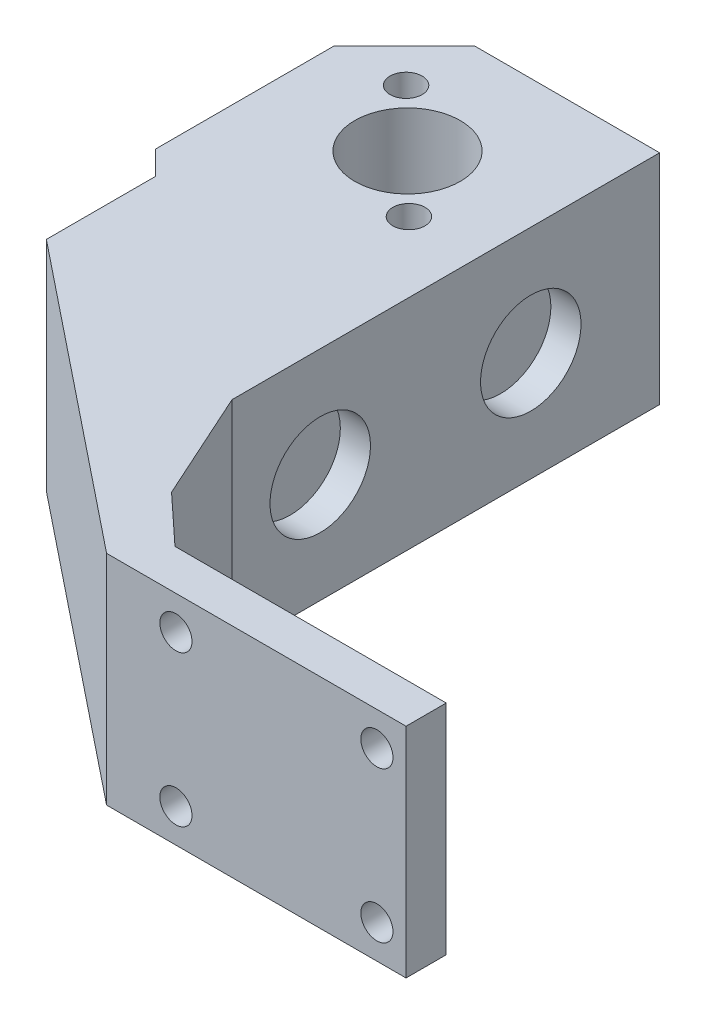
ISO-10303-21;
HEADER;
FILE_DESCRIPTION(('STEP AP214'),'2;1');
FILE_NAME('part.step','',(''),(''),'','','');
FILE_SCHEMA(('AUTOMOTIVE_DESIGN { 1 0 10303 214 1 1 1 1 }'));
ENDSEC;
DATA;
#1=APPLICATION_CONTEXT('core data for automotive mechanical design processes');
#2=APPLICATION_PROTOCOL_DEFINITION('international standard','automotive_design',2000,#1);
#3=PRODUCT_CONTEXT('',#1,'mechanical');
#4=PRODUCT('Part','Part','',(#3));
#5=PRODUCT_RELATED_PRODUCT_CATEGORY('part','',(#4));
#6=PRODUCT_DEFINITION_FORMATION('','',#4);
#7=PRODUCT_DEFINITION_CONTEXT('part definition',#1,'design');
#8=PRODUCT_DEFINITION('design','',#6,#7);
#9=PRODUCT_DEFINITION_SHAPE('','',#8);
#10=(LENGTH_UNIT() NAMED_UNIT(*) SI_UNIT(.MILLI.,.METRE.));
#11=(NAMED_UNIT(*) PLANE_ANGLE_UNIT() SI_UNIT($,.RADIAN.));
#12=(NAMED_UNIT(*) SI_UNIT($,.STERADIAN.) SOLID_ANGLE_UNIT());
#13=UNCERTAINTY_MEASURE_WITH_UNIT(LENGTH_MEASURE(1.E-05),#10,'distance_accuracy_value','');
#14=(GEOMETRIC_REPRESENTATION_CONTEXT(3) GLOBAL_UNCERTAINTY_ASSIGNED_CONTEXT((#13)) GLOBAL_UNIT_ASSIGNED_CONTEXT((#10,
#11,#12)) REPRESENTATION_CONTEXT('',''));
#15=CARTESIAN_POINT('',(0.,0.,0.));
#16=DIRECTION('',(0.,0.,1.));
#17=DIRECTION('',(1.,0.,0.));
#18=AXIS2_PLACEMENT_3D('',#15,#16,#17);
#19=CARTESIAN_POINT('',(0.,0.,4.));
#20=DIRECTION('',(0.,0.,1.));
#21=DIRECTION('',(1.,0.,0.));
#22=AXIS2_PLACEMENT_3D('',#19,#20,#21);
#23=PLANE('',#22);
#24=CARTESIAN_POINT('',(13.3119814523276,-16.5914088903663,4.));
#25=DIRECTION('',(0.,0.,1.));
#26=DIRECTION('',(1.,0.,0.));
#27=AXIS2_PLACEMENT_3D('',#24,#25,#26);
#28=CIRCLE('',#27,1.6);
#29=CARTESIAN_POINT('',(14.9119814523276,-16.5914088903663,4.));
#30=VERTEX_POINT('',#29);
#31=EDGE_CURVE('E183',#30,#30,#28,.T.);
#32=ORIENTED_EDGE('',*,*,#31,.F.);
#33=EDGE_LOOP('',(#32));
#34=FACE_BOUND('',#33,.T.);
#35=CARTESIAN_POINT('',(-6.68801854767252,-1.59140889036635,4.));
#36=DIRECTION('',(0.,0.,1.));
#37=DIRECTION('',(1.,0.,0.));
#38=AXIS2_PLACEMENT_3D('',#35,#36,#37);
#39=CIRCLE('',#38,1.6);
#40=CARTESIAN_POINT('',(-5.08801854767253,-1.59140889036635,4.));
#41=VERTEX_POINT('',#40);
#42=EDGE_CURVE('E195',#41,#41,#39,.T.);
#43=ORIENTED_EDGE('',*,*,#42,.F.);
#44=EDGE_LOOP('',(#43));
#45=FACE_BOUND('',#44,.T.);
#46=DIRECTION('',(0.,1.,0.));
#47=VECTOR('',#46,1.);
#48=CARTESIAN_POINT('',(16.2119814523275,-19.9414088903663,4.));
#49=LINE('',#48,#47);
#50=CARTESIAN_POINT('',(16.2119814523275,-19.9414088903663,4.));
#51=VERTEX_POINT('',#50);
#52=CARTESIAN_POINT('',(16.2119814523275,1.75859110963365,4.));
#53=VERTEX_POINT('',#52);
#54=EDGE_CURVE('E201',#51,#53,#49,.T.);
#55=ORIENTED_EDGE('',*,*,#54,.T.);
#56=DIRECTION('',(-1.,0.,0.));
#57=VECTOR('',#56,1.);
#58=CARTESIAN_POINT('',(16.2119814523275,1.75859110963365,4.));
#59=LINE('',#58,#57);
#60=CARTESIAN_POINT('',(-13.5880185476725,1.75859110963365,4.));
#61=VERTEX_POINT('',#60);
#62=EDGE_CURVE('E128',#53,#61,#59,.T.);
#63=ORIENTED_EDGE('',*,*,#62,.T.);
#64=DIRECTION('',(0.,1.,0.));
#65=VECTOR('',#64,1.);
#66=CARTESIAN_POINT('',(-13.5880185476725,-19.9414088903663,4.));
#67=LINE('',#66,#65);
#68=CARTESIAN_POINT('',(-13.5880185476725,-19.9414088903663,4.));
#69=VERTEX_POINT('',#68);
#70=EDGE_CURVE('E122',#69,#61,#67,.T.);
#71=ORIENTED_EDGE('',*,*,#70,.F.);
#72=DIRECTION('',(1.,0.,0.));
#73=VECTOR('',#72,1.);
#74=CARTESIAN_POINT('',(16.2119814523275,-19.9414088903663,4.));
#75=LINE('',#74,#73);
#76=EDGE_CURVE('E126',#69,#51,#75,.T.);
#77=ORIENTED_EDGE('',*,*,#76,.T.);
#78=EDGE_LOOP('',(#55,#63,#71,#77));
#79=FACE_BOUND('',#78,.T.);
#80=CARTESIAN_POINT('',(13.3119814523275,-1.59140889036635,4.));
#81=DIRECTION('',(0.,0.,1.));
#82=DIRECTION('',(1.,0.,0.));
#83=AXIS2_PLACEMENT_3D('',#80,#81,#82);
#84=CIRCLE('',#83,1.6);
#85=CARTESIAN_POINT('',(14.9119814523275,-1.59140889036635,4.));
#86=VERTEX_POINT('',#85);
#87=EDGE_CURVE('E189',#86,#86,#84,.T.);
#88=ORIENTED_EDGE('',*,*,#87,.F.);
#89=EDGE_LOOP('',(#88));
#90=FACE_BOUND('',#89,.T.);
#91=CARTESIAN_POINT('',(-6.68801854767237,-16.5914088903663,4.));
#92=DIRECTION('',(0.,0.,1.));
#93=DIRECTION('',(1.,0.,0.));
#94=AXIS2_PLACEMENT_3D('',#91,#92,#93);
#95=CIRCLE('',#94,1.6);
#96=CARTESIAN_POINT('',(-5.08801854767237,-16.5914088903663,4.));
#97=VERTEX_POINT('',#96);
#98=EDGE_CURVE('E177',#97,#97,#95,.T.);
#99=ORIENTED_EDGE('',*,*,#98,.F.);
#100=EDGE_LOOP('',(#99));
#101=FACE_BOUND('',#100,.T.);
#102=ADVANCED_FACE('F35',(#34,#45,#79,#90,#101),#23,.T.);
#103=CARTESIAN_POINT('',(0.,0.,0.));
#104=DIRECTION('',(0.,0.,1.));
#105=DIRECTION('',(1.,0.,0.));
#106=AXIS2_PLACEMENT_3D('',#103,#104,#105);
#107=PLANE('',#106);
#108=DIRECTION('',(1.,0.,0.));
#109=VECTOR('',#108,1.);
#110=CARTESIAN_POINT('',(16.2119814523275,-19.9414088903663,0.));
#111=LINE('',#110,#109);
#112=CARTESIAN_POINT('',(-10.783404097235,-19.9414088903663,0.));
#113=VERTEX_POINT('',#112);
#114=CARTESIAN_POINT('',(16.2119814523275,-19.9414088903663,0.));
#115=VERTEX_POINT('',#114);
#116=EDGE_CURVE('E203',#113,#115,#111,.T.);
#117=ORIENTED_EDGE('',*,*,#116,.F.);
#118=DIRECTION('',(0.,1.,0.));
#119=VECTOR('',#118,1.);
#120=CARTESIAN_POINT('',(-10.783404097235,-91.2750298070564,0.));
#121=LINE('',#120,#119);
#122=CARTESIAN_POINT('',(-10.783404097235,1.75859110963365,0.));
#123=VERTEX_POINT('',#122);
#124=EDGE_CURVE('E149',#113,#123,#121,.T.);
#125=ORIENTED_EDGE('',*,*,#124,.T.);
#126=DIRECTION('',(-1.,0.,0.));
#127=VECTOR('',#126,1.);
#128=CARTESIAN_POINT('',(16.2119814523275,1.75859110963365,0.));
#129=LINE('',#128,#127);
#130=CARTESIAN_POINT('',(16.2119814523275,1.75859110963365,0.));
#131=VERTEX_POINT('',#130);
#132=EDGE_CURVE('E207',#131,#123,#129,.T.);
#133=ORIENTED_EDGE('',*,*,#132,.F.);
#134=DIRECTION('',(0.,1.,0.));
#135=VECTOR('',#134,1.);
#136=CARTESIAN_POINT('',(16.2119814523275,-19.9414088903663,0.));
#137=LINE('',#136,#135);
#138=EDGE_CURVE('E198',#115,#131,#137,.T.);
#139=ORIENTED_EDGE('',*,*,#138,.F.);
#140=EDGE_LOOP('',(#117,#125,#133,#139));
#141=FACE_BOUND('',#140,.T.);
#142=CARTESIAN_POINT('',(-6.68801854767252,-1.59140889036635,0.));
#143=DIRECTION('',(0.,0.,1.));
#144=DIRECTION('',(1.,0.,0.));
#145=AXIS2_PLACEMENT_3D('',#142,#143,#144);
#146=CIRCLE('',#145,1.6);
#147=CARTESIAN_POINT('',(-5.08801854767253,-1.59140889036635,0.));
#148=VERTEX_POINT('',#147);
#149=EDGE_CURVE('E192',#148,#148,#146,.T.);
#150=ORIENTED_EDGE('',*,*,#149,.T.);
#151=EDGE_LOOP('',(#150));
#152=FACE_BOUND('',#151,.T.);
#153=CARTESIAN_POINT('',(13.3119814523275,-1.59140889036635,0.));
#154=DIRECTION('',(0.,0.,1.));
#155=DIRECTION('',(1.,0.,0.));
#156=AXIS2_PLACEMENT_3D('',#153,#154,#155);
#157=CIRCLE('',#156,1.6);
#158=CARTESIAN_POINT('',(14.9119814523275,-1.59140889036635,0.));
#159=VERTEX_POINT('',#158);
#160=EDGE_CURVE('E186',#159,#159,#157,.T.);
#161=ORIENTED_EDGE('',*,*,#160,.T.);
#162=EDGE_LOOP('',(#161));
#163=FACE_BOUND('',#162,.T.);
#164=CARTESIAN_POINT('',(13.3119814523276,-16.5914088903663,0.));
#165=DIRECTION('',(0.,0.,1.));
#166=DIRECTION('',(1.,0.,0.));
#167=AXIS2_PLACEMENT_3D('',#164,#165,#166);
#168=CIRCLE('',#167,1.6);
#169=CARTESIAN_POINT('',(14.9119814523276,-16.5914088903663,0.));
#170=VERTEX_POINT('',#169);
#171=EDGE_CURVE('E180',#170,#170,#168,.T.);
#172=ORIENTED_EDGE('',*,*,#171,.T.);
#173=EDGE_LOOP('',(#172));
#174=FACE_BOUND('',#173,.T.);
#175=CARTESIAN_POINT('',(-6.68801854767237,-16.5914088903663,0.));
#176=DIRECTION('',(0.,0.,1.));
#177=DIRECTION('',(1.,0.,0.));
#178=AXIS2_PLACEMENT_3D('',#175,#176,#177);
#179=CIRCLE('',#178,1.6);
#180=CARTESIAN_POINT('',(-5.08801854767237,-16.5914088903663,0.));
#181=VERTEX_POINT('',#180);
#182=EDGE_CURVE('E133',#181,#181,#179,.T.);
#183=ORIENTED_EDGE('',*,*,#182,.T.);
#184=EDGE_LOOP('',(#183));
#185=FACE_BOUND('',#184,.T.);
#186=ADVANCED_FACE('F282',(#141,#152,#163,#174,#185),#107,.F.);
#187=CARTESIAN_POINT('',(16.2119814523275,-19.9414088903663,4.));
#188=DIRECTION('',(-1.,0.,0.));
#189=DIRECTION('',(0.,0.,1.));
#190=AXIS2_PLACEMENT_3D('',#187,#188,#189);
#191=PLANE('',#190);
#192=ORIENTED_EDGE('',*,*,#138,.T.);
#193=DIRECTION('',(0.,0.,-1.));
#194=VECTOR('',#193,1.);
#195=CARTESIAN_POINT('',(16.2119814523275,1.75859110963365,4.));
#196=LINE('',#195,#194);
#197=EDGE_CURVE('E212',#53,#131,#196,.T.);
#198=ORIENTED_EDGE('',*,*,#197,.F.);
#199=ORIENTED_EDGE('',*,*,#54,.F.);
#200=DIRECTION('',(0.,0.,-1.));
#201=VECTOR('',#200,1.);
#202=CARTESIAN_POINT('',(16.2119814523275,-19.9414088903663,4.));
#203=LINE('',#202,#201);
#204=EDGE_CURVE('E142',#51,#115,#203,.T.);
#205=ORIENTED_EDGE('',*,*,#204,.T.);
#206=EDGE_LOOP('',(#192,#198,#199,#205));
#207=FACE_BOUND('',#206,.T.);
#208=ADVANCED_FACE('F305',(#207),#191,.F.);
#209=CARTESIAN_POINT('',(16.2119814523275,1.75859110963365,4.));
#210=DIRECTION('',(0.,-1.,0.));
#211=DIRECTION('',(0.,0.,-1.));
#212=AXIS2_PLACEMENT_3D('',#209,#210,#211);
#213=PLANE('',#212);
#214=DIRECTION('',(1.,0.,0.));
#215=VECTOR('',#214,1.);
#216=CARTESIAN_POINT('',(0.,1.75859110963365,-58.0376740014877));
#217=LINE('',#216,#215);
#218=CARTESIAN_POINT('',(-38.9943750803133,1.75859110963365,-58.0376740014877));
#219=VERTEX_POINT('',#218);
#220=CARTESIAN_POINT('',(-20.5891308746507,1.75859110963365,-58.0376740014877));
#221=VERTEX_POINT('',#220);
#222=EDGE_CURVE('E170',#219,#221,#217,.T.);
#223=ORIENTED_EDGE('',*,*,#222,.F.);
#224=DIRECTION('',(0.707106781186546,0.,-0.707106781186549));
#225=VECTOR('',#224,1.);
#226=CARTESIAN_POINT('',(-38.9943750803133,1.75859110963365,-58.0376740014877));
#227=LINE('',#226,#225);
#228=CARTESIAN_POINT('',(-45.9943750803133,1.75859110963365,-51.0376740014877));
#229=VERTEX_POINT('',#228);
#230=EDGE_CURVE('E57',#219,#229,#227,.F.);
#231=ORIENTED_EDGE('',*,*,#230,.T.);
#232=DIRECTION('',(0.,0.,-1.));
#233=VECTOR('',#232,1.);
#234=CARTESIAN_POINT('',(-45.9943750803133,1.75859110963365,0.));
#235=LINE('',#234,#233);
#236=CARTESIAN_POINT('',(-45.9943750803133,1.75859110963365,-33.2623259985122));
#237=VERTEX_POINT('',#236);
#238=EDGE_CURVE('E171',#237,#229,#235,.T.);
#239=ORIENTED_EDGE('',*,*,#238,.F.);
#240=DIRECTION('',(0.707106781186556,0.,0.707106781186539));
#241=VECTOR('',#240,1.);
#242=CARTESIAN_POINT('',(-6.36602454090001,1.75859110963365,6.36602454090016));
#243=LINE('',#242,#241);
#244=CARTESIAN_POINT('',(-43.6401523047004,1.75859110963365,-30.9081032228994));
#245=VERTEX_POINT('',#244);
#246=EDGE_CURVE('E162',#237,#245,#243,.T.);
#247=ORIENTED_EDGE('',*,*,#246,.T.);
#248=DIRECTION('',(0.,0.,-1.));
#249=VECTOR('',#248,1.);
#250=CARTESIAN_POINT('',(-43.6401523047004,1.75859110963365,0.));
#251=LINE('',#250,#249);
#252=CARTESIAN_POINT('',(-43.6401523047004,1.75859110963365,-20.0597806830785));
#253=VERTEX_POINT('',#252);
#254=EDGE_CURVE('E264',#253,#245,#251,.T.);
#255=ORIENTED_EDGE('',*,*,#254,.F.);
#256=DIRECTION('',(-0.780639739816673,0.,-0.624981277014725));
#257=VECTOR('',#256,1.);
#258=CARTESIAN_POINT('',(-7.25904262552515,1.75859110963365,9.06698705211705));
#259=LINE('',#258,#257);
#260=EDGE_CURVE('E148',#61,#253,#259,.T.);
#261=ORIENTED_EDGE('',*,*,#260,.F.);
#262=ORIENTED_EDGE('',*,*,#62,.F.);
#263=ORIENTED_EDGE('',*,*,#197,.T.);
#264=ORIENTED_EDGE('',*,*,#132,.T.);
#265=DIRECTION('',(-0.732304910686777,0.,-0.680976884911692));
#266=VECTOR('',#265,1.);
#267=CARTESIAN_POINT('',(-5.00058278208112,1.75859110963365,5.37749725247815));
#268=LINE('',#267,#266);
#269=CARTESIAN_POINT('',(-15.6228129695564,1.75859110963365,-4.50020958564489));
#270=VERTEX_POINT('',#269);
#271=EDGE_CURVE('E239',#123,#270,#268,.T.);
#272=ORIENTED_EDGE('',*,*,#271,.T.);
#273=DIRECTION('',(-0.411997316826914,0.,-0.911185058551458));
#274=VECTOR('',#273,1.);
#275=CARTESIAN_POINT('',(-11.2815639694392,1.75859110963365,5.10102096319401));
#276=LINE('',#275,#274);
#277=CARTESIAN_POINT('',(-20.5891308746507,1.75859110963365,-15.4838604161662));
#278=VERTEX_POINT('',#277);
#279=EDGE_CURVE('E237',#270,#278,#276,.T.);
#280=ORIENTED_EDGE('',*,*,#279,.T.);
#281=DIRECTION('',(0.,0.,1.));
#282=VECTOR('',#281,1.);
#283=CARTESIAN_POINT('',(-20.5891308746507,1.75859110963365,0.));
#284=LINE('',#283,#282);
#285=EDGE_CURVE('E230',#221,#278,#284,.T.);
#286=ORIENTED_EDGE('',*,*,#285,.F.);
#287=EDGE_LOOP('',(#223,#231,#239,#247,#255,#261,#262,#263,#264,#272,#280,#286));
#288=FACE_BOUND('',#287,.T.);
#289=CARTESIAN_POINT('',(-27.5643417870639,1.75859110963365,-40.0645939220256));
#290=DIRECTION('',(0.,1.,0.));
#291=DIRECTION('',(0.,0.,1.));
#292=AXIS2_PLACEMENT_3D('',#289,#290,#291);
#293=CIRCLE('',#292,1.6);
#294=CARTESIAN_POINT('',(-27.5643417870639,1.75859110963365,-38.4645939220255));
#295=VERTEX_POINT('',#294);
#296=EDGE_CURVE('E252',#295,#295,#293,.T.);
#297=ORIENTED_EDGE('',*,*,#296,.F.);
#298=EDGE_LOOP('',(#297));
#299=FACE_BOUND('',#298,.T.);
#300=CARTESIAN_POINT('',(-39.0191641678999,1.75859110963365,-51.2354060779746));
#301=DIRECTION('',(0.,1.,0.));
#302=DIRECTION('',(0.,0.,1.));
#303=AXIS2_PLACEMENT_3D('',#300,#301,#302);
#304=CIRCLE('',#303,1.6);
#305=CARTESIAN_POINT('',(-39.0191641678999,1.75859110963365,-49.6354060779746));
#306=VERTEX_POINT('',#305);
#307=EDGE_CURVE('E248',#306,#306,#304,.T.);
#308=ORIENTED_EDGE('',*,*,#307,.F.);
#309=EDGE_LOOP('',(#308));
#310=FACE_BOUND('',#309,.T.);
#311=CARTESIAN_POINT('',(-33.291752977482,1.75859110963365,-45.6499999999999));
#312=DIRECTION('',(0.,1.,0.));
#313=DIRECTION('',(0.,0.,1.));
#314=AXIS2_PLACEMENT_3D('',#311,#312,#313);
#315=CIRCLE('',#314,5.25);
#316=CARTESIAN_POINT('',(-33.291752977482,1.75859110963365,-40.3999999999999));
#317=VERTEX_POINT('',#316);
#318=EDGE_CURVE('E243',#317,#317,#315,.T.);
#319=ORIENTED_EDGE('',*,*,#318,.F.);
#320=EDGE_LOOP('',(#319));
#321=FACE_BOUND('',#320,.T.);
#322=ADVANCED_FACE('F226',(#288,#299,#310,#321),#213,.F.);
#323=CARTESIAN_POINT('',(16.2119814523275,-19.9414088903663,4.));
#324=DIRECTION('',(0.,1.,0.));
#325=DIRECTION('',(0.,0.,1.));
#326=AXIS2_PLACEMENT_3D('',#323,#324,#325);
#327=PLANE('',#326);
#328=DIRECTION('',(0.,0.,1.));
#329=VECTOR('',#328,1.);
#330=CARTESIAN_POINT('',(-45.9943750803133,-19.9414088903663,0.));
#331=LINE('',#330,#329);
#332=CARTESIAN_POINT('',(-45.9943750803133,-19.9414088903663,-51.0376740014877));
#333=VERTEX_POINT('',#332);
#334=CARTESIAN_POINT('',(-45.9943750803133,-19.9414088903663,-33.2623259985122));
#335=VERTEX_POINT('',#334);
#336=EDGE_CURVE('E163',#333,#335,#331,.T.);
#337=ORIENTED_EDGE('',*,*,#336,.F.);
#338=DIRECTION('',(-0.707106781186546,0.,0.707106781186549));
#339=VECTOR('',#338,1.);
#340=CARTESIAN_POINT('',(-38.9943750803133,-19.9414088903663,-58.0376740014877));
#341=LINE('',#340,#339);
#342=CARTESIAN_POINT('',(-38.9943750803133,-19.9414088903663,-58.0376740014877));
#343=VERTEX_POINT('',#342);
#344=EDGE_CURVE('E11',#333,#343,#341,.F.);
#345=ORIENTED_EDGE('',*,*,#344,.T.);
#346=DIRECTION('',(-1.,0.,0.));
#347=VECTOR('',#346,1.);
#348=CARTESIAN_POINT('',(0.,-19.9414088903663,-58.0376740014877));
#349=LINE('',#348,#347);
#350=CARTESIAN_POINT('',(-20.5891308746507,-19.9414088903663,-58.0376740014877));
#351=VERTEX_POINT('',#350);
#352=EDGE_CURVE('E167',#351,#343,#349,.T.);
#353=ORIENTED_EDGE('',*,*,#352,.F.);
#354=DIRECTION('',(0.,0.,-1.));
#355=VECTOR('',#354,1.);
#356=CARTESIAN_POINT('',(-20.5891308746507,-19.9414088903663,0.));
#357=LINE('',#356,#355);
#358=CARTESIAN_POINT('',(-20.5891308746507,-19.9414088903663,-15.4838604161662));
#359=VERTEX_POINT('',#358);
#360=EDGE_CURVE('E172',#359,#351,#357,.T.);
#361=ORIENTED_EDGE('',*,*,#360,.F.);
#362=DIRECTION('',(0.411997316826914,0.,0.911185058551458));
#363=VECTOR('',#362,1.);
#364=CARTESIAN_POINT('',(-11.2815639694392,-19.9414088903663,5.10102096319401));
#365=LINE('',#364,#363);
#366=CARTESIAN_POINT('',(-15.6228129695564,-19.9414088903663,-4.50020958564489));
#367=VERTEX_POINT('',#366);
#368=EDGE_CURVE('E161',#359,#367,#365,.T.);
#369=ORIENTED_EDGE('',*,*,#368,.T.);
#370=DIRECTION('',(0.732304910686777,0.,0.680976884911692));
#371=VECTOR('',#370,1.);
#372=CARTESIAN_POINT('',(-5.00058278208112,-19.9414088903663,5.37749725247815));
#373=LINE('',#372,#371);
#374=EDGE_CURVE('E134',#367,#113,#373,.T.);
#375=ORIENTED_EDGE('',*,*,#374,.T.);
#376=ORIENTED_EDGE('',*,*,#116,.T.);
#377=ORIENTED_EDGE('',*,*,#204,.F.);
#378=ORIENTED_EDGE('',*,*,#76,.F.);
#379=DIRECTION('',(0.780639739816673,0.,0.624981277014725));
#380=VECTOR('',#379,1.);
#381=CARTESIAN_POINT('',(-7.25904262552515,-19.9414088903663,9.06698705211705));
#382=LINE('',#381,#380);
#383=CARTESIAN_POINT('',(-43.6401523047004,-19.9414088903663,-20.0597806830785));
#384=VERTEX_POINT('',#383);
#385=EDGE_CURVE('E139',#384,#69,#382,.T.);
#386=ORIENTED_EDGE('',*,*,#385,.F.);
#387=DIRECTION('',(0.,0.,1.));
#388=VECTOR('',#387,1.);
#389=CARTESIAN_POINT('',(-43.6401523047004,-19.9414088903663,0.));
#390=LINE('',#389,#388);
#391=CARTESIAN_POINT('',(-43.6401523047004,-19.9414088903663,-30.9081032228994));
#392=VERTEX_POINT('',#391);
#393=EDGE_CURVE('E151',#392,#384,#390,.T.);
#394=ORIENTED_EDGE('',*,*,#393,.F.);
#395=DIRECTION('',(-0.707106781186556,0.,-0.707106781186539));
#396=VECTOR('',#395,1.);
#397=CARTESIAN_POINT('',(-6.36602454090001,-19.9414088903663,6.36602454090016));
#398=LINE('',#397,#396);
#399=EDGE_CURVE('E158',#392,#335,#398,.T.);
#400=ORIENTED_EDGE('',*,*,#399,.T.);
#401=EDGE_LOOP('',(#337,#345,#353,#361,#369,#375,#376,#377,#378,#386,#394,#400));
#402=FACE_BOUND('',#401,.T.);
#403=CARTESIAN_POINT('',(-39.0191641678999,-19.9414088903663,-51.2354060779746));
#404=DIRECTION('',(0.,1.,0.));
#405=DIRECTION('',(0.,0.,1.));
#406=AXIS2_PLACEMENT_3D('',#403,#404,#405);
#407=CIRCLE('',#406,1.6);
#408=CARTESIAN_POINT('',(-39.0191641678999,-19.9414088903663,-49.6354060779746));
#409=VERTEX_POINT('',#408);
#410=EDGE_CURVE('E246',#409,#409,#407,.F.);
#411=ORIENTED_EDGE('',*,*,#410,.F.);
#412=EDGE_LOOP('',(#411));
#413=FACE_BOUND('',#412,.T.);
#414=CARTESIAN_POINT('',(-27.5643417870639,-19.9414088903663,-40.0645939220256));
#415=DIRECTION('',(0.,1.,0.));
#416=DIRECTION('',(0.,0.,1.));
#417=AXIS2_PLACEMENT_3D('',#414,#415,#416);
#418=CIRCLE('',#417,1.6);
#419=CARTESIAN_POINT('',(-27.5643417870639,-19.9414088903663,-38.4645939220255));
#420=VERTEX_POINT('',#419);
#421=EDGE_CURVE('E251',#420,#420,#418,.F.);
#422=ORIENTED_EDGE('',*,*,#421,.F.);
#423=EDGE_LOOP('',(#422));
#424=FACE_BOUND('',#423,.T.);
#425=CARTESIAN_POINT('',(-33.291752977482,-19.9414088903663,-45.6499999999999));
#426=DIRECTION('',(0.,1.,0.));
#427=DIRECTION('',(0.,0.,1.));
#428=AXIS2_PLACEMENT_3D('',#425,#426,#427);
#429=CIRCLE('',#428,5.25);
#430=CARTESIAN_POINT('',(-33.291752977482,-19.9414088903663,-40.3999999999999));
#431=VERTEX_POINT('',#430);
#432=EDGE_CURVE('E247',#431,#431,#429,.F.);
#433=ORIENTED_EDGE('',*,*,#432,.F.);
#434=EDGE_LOOP('',(#433));
#435=FACE_BOUND('',#434,.T.);
#436=ADVANCED_FACE('F137',(#402,#413,#424,#435),#327,.F.);
#437=CARTESIAN_POINT('',(-6.68801854767252,-1.59140889036635,4.));
#438=DIRECTION('',(0.,0.,-1.));
#439=DIRECTION('',(-1.,0.,0.));
#440=AXIS2_PLACEMENT_3D('',#437,#438,#439);
#441=CYLINDRICAL_SURFACE('',#440,1.6);
#442=ORIENTED_EDGE('',*,*,#42,.T.);
#443=EDGE_LOOP('',(#442));
#444=FACE_BOUND('',#443,.T.);
#445=ORIENTED_EDGE('',*,*,#149,.F.);
#446=EDGE_LOOP('',(#445));
#447=FACE_BOUND('',#446,.T.);
#448=ADVANCED_FACE('F310',(#444,#447),#441,.F.);
#449=CARTESIAN_POINT('',(13.3119814523275,-1.59140889036635,4.));
#450=DIRECTION('',(0.,0.,-1.));
#451=DIRECTION('',(-1.,0.,0.));
#452=AXIS2_PLACEMENT_3D('',#449,#450,#451);
#453=CYLINDRICAL_SURFACE('',#452,1.6);
#454=ORIENTED_EDGE('',*,*,#87,.T.);
#455=EDGE_LOOP('',(#454));
#456=FACE_BOUND('',#455,.T.);
#457=ORIENTED_EDGE('',*,*,#160,.F.);
#458=EDGE_LOOP('',(#457));
#459=FACE_BOUND('',#458,.T.);
#460=ADVANCED_FACE('F338',(#456,#459),#453,.F.);
#461=CARTESIAN_POINT('',(13.3119814523276,-16.5914088903663,4.));
#462=DIRECTION('',(0.,0.,-1.));
#463=DIRECTION('',(-1.,0.,0.));
#464=AXIS2_PLACEMENT_3D('',#461,#462,#463);
#465=CYLINDRICAL_SURFACE('',#464,1.6);
#466=ORIENTED_EDGE('',*,*,#31,.T.);
#467=EDGE_LOOP('',(#466));
#468=FACE_BOUND('',#467,.T.);
#469=ORIENTED_EDGE('',*,*,#171,.F.);
#470=EDGE_LOOP('',(#469));
#471=FACE_BOUND('',#470,.T.);
#472=ADVANCED_FACE('F345',(#468,#471),#465,.F.);
#473=CARTESIAN_POINT('',(-6.68801854767237,-16.5914088903663,4.));
#474=DIRECTION('',(0.,0.,-1.));
#475=DIRECTION('',(-1.,0.,0.));
#476=AXIS2_PLACEMENT_3D('',#473,#474,#475);
#477=CYLINDRICAL_SURFACE('',#476,1.6);
#478=ORIENTED_EDGE('',*,*,#98,.T.);
#479=EDGE_LOOP('',(#478));
#480=FACE_BOUND('',#479,.T.);
#481=ORIENTED_EDGE('',*,*,#182,.F.);
#482=EDGE_LOOP('',(#481));
#483=FACE_BOUND('',#482,.T.);
#484=ADVANCED_FACE('F352',(#480,#483),#477,.F.);
#485=CARTESIAN_POINT('',(-7.25904262552515,-91.2750298070564,9.06698705211705));
#486=DIRECTION('',(0.624981277014725,0.,-0.780639739816673));
#487=DIRECTION('',(-0.780639739816673,0.,-0.624981277014725));
#488=AXIS2_PLACEMENT_3D('',#485,#486,#487);
#489=PLANE('',#488);
#490=DIRECTION('',(0.,1.,0.));
#491=VECTOR('',#490,1.);
#492=CARTESIAN_POINT('',(-43.6401523047004,-91.2750298070564,-20.0597806830785));
#493=LINE('',#492,#491);
#494=EDGE_CURVE('E147',#384,#253,#493,.T.);
#495=ORIENTED_EDGE('',*,*,#494,.F.);
#496=ORIENTED_EDGE('',*,*,#385,.T.);
#497=ORIENTED_EDGE('',*,*,#70,.T.);
#498=ORIENTED_EDGE('',*,*,#260,.T.);
#499=EDGE_LOOP('',(#495,#496,#497,#498));
#500=FACE_BOUND('',#499,.T.);
#501=ADVANCED_FACE('F146',(#500),#489,.F.);
#502=CARTESIAN_POINT('',(-43.6401523047004,-91.2750298070564,0.));
#503=DIRECTION('',(1.,0.,0.));
#504=DIRECTION('',(0.,0.,-1.));
#505=AXIS2_PLACEMENT_3D('',#502,#503,#504);
#506=PLANE('',#505);
#507=DIRECTION('',(0.,1.,0.));
#508=VECTOR('',#507,1.);
#509=CARTESIAN_POINT('',(-43.6401523047004,-91.2750298070564,-30.9081032228994));
#510=LINE('',#509,#508);
#511=EDGE_CURVE('E166',#392,#245,#510,.T.);
#512=ORIENTED_EDGE('',*,*,#511,.F.);
#513=ORIENTED_EDGE('',*,*,#393,.T.);
#514=ORIENTED_EDGE('',*,*,#494,.T.);
#515=ORIENTED_EDGE('',*,*,#254,.T.);
#516=EDGE_LOOP('',(#512,#513,#514,#515));
#517=FACE_BOUND('',#516,.T.);
#518=ADVANCED_FACE('F367',(#517),#506,.F.);
#519=CARTESIAN_POINT('',(-6.36602454090001,-91.2750298070564,6.36602454090016));
#520=DIRECTION('',(-0.707106781186539,0.,0.707106781186556));
#521=DIRECTION('',(0.707106781186556,0.,0.707106781186539));
#522=AXIS2_PLACEMENT_3D('',#519,#520,#521);
#523=PLANE('',#522);
#524=ORIENTED_EDGE('',*,*,#399,.F.);
#525=ORIENTED_EDGE('',*,*,#511,.T.);
#526=ORIENTED_EDGE('',*,*,#246,.F.);
#527=DIRECTION('',(0.,1.,0.));
#528=VECTOR('',#527,1.);
#529=CARTESIAN_POINT('',(-45.9943750803133,-91.2750298070564,-33.2623259985122));
#530=LINE('',#529,#528);
#531=EDGE_CURVE('E165',#335,#237,#530,.T.);
#532=ORIENTED_EDGE('',*,*,#531,.F.);
#533=EDGE_LOOP('',(#524,#525,#526,#532));
#534=FACE_BOUND('',#533,.T.);
#535=ADVANCED_FACE('F374',(#534),#523,.T.);
#536=CARTESIAN_POINT('',(-45.9943750803133,-91.2750298070564,0.));
#537=DIRECTION('',(1.,0.,0.));
#538=DIRECTION('',(0.,0.,-1.));
#539=AXIS2_PLACEMENT_3D('',#536,#537,#538);
#540=PLANE('',#539);
#541=ORIENTED_EDGE('',*,*,#238,.T.);
#542=DIRECTION('',(0.,-1.,0.));
#543=VECTOR('',#542,1.);
#544=CARTESIAN_POINT('',(-45.9943750803133,-91.2750298070564,-51.0376740014877));
#545=LINE('',#544,#543);
#546=EDGE_CURVE('E43',#229,#333,#545,.T.);
#547=ORIENTED_EDGE('',*,*,#546,.T.);
#548=ORIENTED_EDGE('',*,*,#336,.T.);
#549=ORIENTED_EDGE('',*,*,#531,.T.);
#550=EDGE_LOOP('',(#541,#547,#548,#549));
#551=FACE_BOUND('',#550,.T.);
#552=ADVANCED_FACE('F295',(#551),#540,.F.);
#553=CARTESIAN_POINT('',(0.,-91.2750298070564,-58.0376740014877));
#554=DIRECTION('',(0.,0.,1.));
#555=DIRECTION('',(1.,0.,0.));
#556=AXIS2_PLACEMENT_3D('',#553,#554,#555);
#557=PLANE('',#556);
#558=ORIENTED_EDGE('',*,*,#352,.T.);
#559=DIRECTION('',(0.,1.,0.));
#560=VECTOR('',#559,1.);
#561=CARTESIAN_POINT('',(-38.9943750803133,-91.2750298070564,-58.0376740014877));
#562=LINE('',#561,#560);
#563=EDGE_CURVE('E215',#343,#219,#562,.T.);
#564=ORIENTED_EDGE('',*,*,#563,.T.);
#565=ORIENTED_EDGE('',*,*,#222,.T.);
#566=DIRECTION('',(0.,1.,0.));
#567=VECTOR('',#566,1.);
#568=CARTESIAN_POINT('',(-20.5891308746507,-91.2750298070564,-58.0376740014877));
#569=LINE('',#568,#567);
#570=EDGE_CURVE('E175',#351,#221,#569,.T.);
#571=ORIENTED_EDGE('',*,*,#570,.F.);
#572=EDGE_LOOP('',(#558,#564,#565,#571));
#573=FACE_BOUND('',#572,.T.);
#574=ADVANCED_FACE('F220',(#573),#557,.F.);
#575=CARTESIAN_POINT('',(-20.5891308746507,-91.2750298070564,0.));
#576=DIRECTION('',(-1.,0.,0.));
#577=DIRECTION('',(0.,0.,1.));
#578=AXIS2_PLACEMENT_3D('',#575,#576,#577);
#579=PLANE('',#578);
#580=CARTESIAN_POINT('',(-20.5891308746507,-9.09140889036635,-24.263711451395));
#581=DIRECTION('',(1.,0.,0.));
#582=DIRECTION('',(0.,0.,-1.));
#583=AXIS2_PLACEMENT_3D('',#580,#581,#582);
#584=CIRCLE('',#583,5.);
#585=CARTESIAN_POINT('',(-20.5891308746507,-9.09140889036635,-29.263711451395));
#586=VERTEX_POINT('',#585);
#587=EDGE_CURVE('E506',#586,#586,#584,.T.);
#588=ORIENTED_EDGE('',*,*,#587,.F.);
#589=EDGE_LOOP('',(#588));
#590=FACE_BOUND('',#589,.T.);
#591=CARTESIAN_POINT('',(-20.5891308746507,-9.09140889036635,-45.2162183072864));
#592=DIRECTION('',(1.,0.,0.));
#593=DIRECTION('',(0.,0.,-1.));
#594=AXIS2_PLACEMENT_3D('',#591,#592,#593);
#595=CIRCLE('',#594,5.);
#596=CARTESIAN_POINT('',(-20.5891308746507,-9.09140889036635,-50.2162183072864));
#597=VERTEX_POINT('',#596);
#598=EDGE_CURVE('E514',#597,#597,#595,.T.);
#599=ORIENTED_EDGE('',*,*,#598,.F.);
#600=EDGE_LOOP('',(#599));
#601=FACE_BOUND('',#600,.T.);
#602=DIRECTION('',(0.,1.,0.));
#603=VECTOR('',#602,1.);
#604=CARTESIAN_POINT('',(-20.5891308746507,-91.2750298070564,-15.4838604161662));
#605=LINE('',#604,#603);
#606=EDGE_CURVE('E236',#359,#278,#605,.T.);
#607=ORIENTED_EDGE('',*,*,#606,.F.);
#608=ORIENTED_EDGE('',*,*,#360,.T.);
#609=ORIENTED_EDGE('',*,*,#570,.T.);
#610=ORIENTED_EDGE('',*,*,#285,.T.);
#611=EDGE_LOOP('',(#607,#608,#609,#610));
#612=FACE_BOUND('',#611,.T.);
#613=ADVANCED_FACE('F285',(#590,#601,#612),#579,.F.);
#614=CARTESIAN_POINT('',(-11.2815639694392,-91.2750298070564,5.10102096319401));
#615=DIRECTION('',(0.911185058551458,0.,-0.411997316826914));
#616=DIRECTION('',(-0.411997316826914,0.,-0.911185058551458));
#617=AXIS2_PLACEMENT_3D('',#614,#615,#616);
#618=PLANE('',#617);
#619=ORIENTED_EDGE('',*,*,#368,.F.);
#620=ORIENTED_EDGE('',*,*,#606,.T.);
#621=ORIENTED_EDGE('',*,*,#279,.F.);
#622=DIRECTION('',(0.,1.,0.));
#623=VECTOR('',#622,1.);
#624=CARTESIAN_POINT('',(-15.6228129695564,-91.2750298070564,-4.50020958564489));
#625=LINE('',#624,#623);
#626=EDGE_CURVE('E242',#367,#270,#625,.T.);
#627=ORIENTED_EDGE('',*,*,#626,.F.);
#628=EDGE_LOOP('',(#619,#620,#621,#627));
#629=FACE_BOUND('',#628,.T.);
#630=ADVANCED_FACE('F277',(#629),#618,.T.);
#631=CARTESIAN_POINT('',(-33.291752977482,-91.2750298070564,-45.6499999999999));
#632=DIRECTION('',(0.,1.,0.));
#633=DIRECTION('',(0.,0.,1.));
#634=AXIS2_PLACEMENT_3D('',#631,#632,#633);
#635=CYLINDRICAL_SURFACE('',#634,5.25);
#636=ORIENTED_EDGE('',*,*,#432,.T.);
#637=EDGE_LOOP('',(#636));
#638=FACE_BOUND('',#637,.T.);
#639=ORIENTED_EDGE('',*,*,#318,.T.);
#640=EDGE_LOOP('',(#639));
#641=FACE_BOUND('',#640,.T.);
#642=ADVANCED_FACE('F293',(#638,#641),#635,.F.);
#643=CARTESIAN_POINT('',(-39.0191641678999,-91.2750298070564,-51.2354060779746));
#644=DIRECTION('',(0.,1.,0.));
#645=DIRECTION('',(0.,0.,1.));
#646=AXIS2_PLACEMENT_3D('',#643,#644,#645);
#647=CYLINDRICAL_SURFACE('',#646,1.6);
#648=ORIENTED_EDGE('',*,*,#410,.T.);
#649=EDGE_LOOP('',(#648));
#650=FACE_BOUND('',#649,.T.);
#651=ORIENTED_EDGE('',*,*,#307,.T.);
#652=EDGE_LOOP('',(#651));
#653=FACE_BOUND('',#652,.T.);
#654=ADVANCED_FACE('F457',(#650,#653),#647,.F.);
#655=CARTESIAN_POINT('',(-27.5643417870639,-91.2750298070564,-40.0645939220256));
#656=DIRECTION('',(0.,1.,0.));
#657=DIRECTION('',(0.,0.,1.));
#658=AXIS2_PLACEMENT_3D('',#655,#656,#657);
#659=CYLINDRICAL_SURFACE('',#658,1.6);
#660=ORIENTED_EDGE('',*,*,#421,.T.);
#661=EDGE_LOOP('',(#660));
#662=FACE_BOUND('',#661,.T.);
#663=ORIENTED_EDGE('',*,*,#296,.T.);
#664=EDGE_LOOP('',(#663));
#665=FACE_BOUND('',#664,.T.);
#666=ADVANCED_FACE('F461',(#662,#665),#659,.F.);
#667=CARTESIAN_POINT('',(-5.00058278208112,-91.2750298070564,5.37749725247815));
#668=DIRECTION('',(0.680976884911692,0.,-0.732304910686777));
#669=DIRECTION('',(-0.732304910686777,0.,-0.680976884911692));
#670=AXIS2_PLACEMENT_3D('',#667,#668,#669);
#671=PLANE('',#670);
#672=ORIENTED_EDGE('',*,*,#374,.F.);
#673=ORIENTED_EDGE('',*,*,#626,.T.);
#674=ORIENTED_EDGE('',*,*,#271,.F.);
#675=ORIENTED_EDGE('',*,*,#124,.F.);
#676=EDGE_LOOP('',(#672,#673,#674,#675));
#677=FACE_BOUND('',#676,.T.);
#678=ADVANCED_FACE('F273',(#677),#671,.T.);
#679=CARTESIAN_POINT('',(-38.9943750803133,-91.2750298070564,-58.0376740014877));
#680=DIRECTION('',(0.707106781186549,0.,0.707106781186546));
#681=DIRECTION('',(0.,1.,0.));
#682=AXIS2_PLACEMENT_3D('',#679,#680,#681);
#683=PLANE('',#682);
#684=ORIENTED_EDGE('',*,*,#344,.F.);
#685=ORIENTED_EDGE('',*,*,#546,.F.);
#686=ORIENTED_EDGE('',*,*,#230,.F.);
#687=ORIENTED_EDGE('',*,*,#563,.F.);
#688=EDGE_LOOP('',(#684,#685,#686,#687));
#689=FACE_BOUND('',#688,.T.);
#690=ADVANCED_FACE('F37',(#689),#683,.F.);
#691=CARTESIAN_POINT('',(-23.5891308746507,-9.09140889036635,-45.2162183072864));
#692=DIRECTION('',(1.,0.,0.));
#693=DIRECTION('',(0.,0.,-1.));
#694=AXIS2_PLACEMENT_3D('',#691,#692,#693);
#695=CYLINDRICAL_SURFACE('',#694,5.);
#696=CARTESIAN_POINT('',(-23.5891308746507,-9.09140889036635,-45.2162183072864));
#697=DIRECTION('',(1.,0.,0.));
#698=DIRECTION('',(0.,0.,-1.));
#699=AXIS2_PLACEMENT_3D('',#696,#697,#698);
#700=CIRCLE('',#699,5.);
#701=CARTESIAN_POINT('',(-23.5891308746507,-9.09140889036635,-50.2162183072864));
#702=VERTEX_POINT('',#701);
#703=EDGE_CURVE('E509',#702,#702,#700,.T.);
#704=ORIENTED_EDGE('',*,*,#703,.F.);
#705=EDGE_LOOP('',(#704));
#706=FACE_BOUND('',#705,.T.);
#707=ORIENTED_EDGE('',*,*,#598,.T.);
#708=EDGE_LOOP('',(#707));
#709=FACE_BOUND('',#708,.T.);
#710=ADVANCED_FACE('F403',(#706,#709),#695,.F.);
#711=CARTESIAN_POINT('',(-23.5891308746507,-9.09140889036635,-45.2162183072864));
#712=DIRECTION('',(1.,0.,0.));
#713=DIRECTION('',(0.,0.,-1.));
#714=AXIS2_PLACEMENT_3D('',#711,#712,#713);
#715=PLANE('',#714);
#716=ORIENTED_EDGE('',*,*,#703,.T.);
#717=EDGE_LOOP('',(#716));
#718=FACE_BOUND('',#717,.T.);
#719=ADVANCED_FACE('F419',(#718),#715,.T.);
#720=CARTESIAN_POINT('',(-23.5891308746507,-9.09140889036635,-24.263711451395));
#721=DIRECTION('',(1.,0.,0.));
#722=DIRECTION('',(0.,0.,-1.));
#723=AXIS2_PLACEMENT_3D('',#720,#721,#722);
#724=CYLINDRICAL_SURFACE('',#723,5.);
#725=CARTESIAN_POINT('',(-23.5891308746507,-9.09140889036635,-24.263711451395));
#726=DIRECTION('',(1.,0.,0.));
#727=DIRECTION('',(0.,0.,-1.));
#728=AXIS2_PLACEMENT_3D('',#725,#726,#727);
#729=CIRCLE('',#728,5.);
#730=CARTESIAN_POINT('',(-23.5891308746507,-9.09140889036635,-29.263711451395));
#731=VERTEX_POINT('',#730);
#732=EDGE_CURVE('E153',#731,#731,#729,.T.);
#733=ORIENTED_EDGE('',*,*,#732,.F.);
#734=EDGE_LOOP('',(#733));
#735=FACE_BOUND('',#734,.T.);
#736=ORIENTED_EDGE('',*,*,#587,.T.);
#737=EDGE_LOOP('',(#736));
#738=FACE_BOUND('',#737,.T.);
#739=ADVANCED_FACE('F429',(#735,#738),#724,.F.);
#740=CARTESIAN_POINT('',(-23.5891308746507,-9.09140889036635,-24.263711451395));
#741=DIRECTION('',(1.,0.,0.));
#742=DIRECTION('',(0.,0.,-1.));
#743=AXIS2_PLACEMENT_3D('',#740,#741,#742);
#744=PLANE('',#743);
#745=ORIENTED_EDGE('',*,*,#732,.T.);
#746=EDGE_LOOP('',(#745));
#747=FACE_BOUND('',#746,.T.);
#748=ADVANCED_FACE('F439',(#747),#744,.T.);
#749=CLOSED_SHELL('',(#102,#186,#208,#322,#436,#448,#460,#472,#484,#501,#518,#535,#552,#574,
#613,#630,#642,#654,#666,#678,#690,#710,#719,#739,#748));
#750=MANIFOLD_SOLID_BREP('B2',#749);
#751=ADVANCED_BREP_SHAPE_REPRESENTATION('',(#18,#750),#14);
#752=SHAPE_DEFINITION_REPRESENTATION(#9,#751);
ENDSEC;
END-ISO-10303-21;
